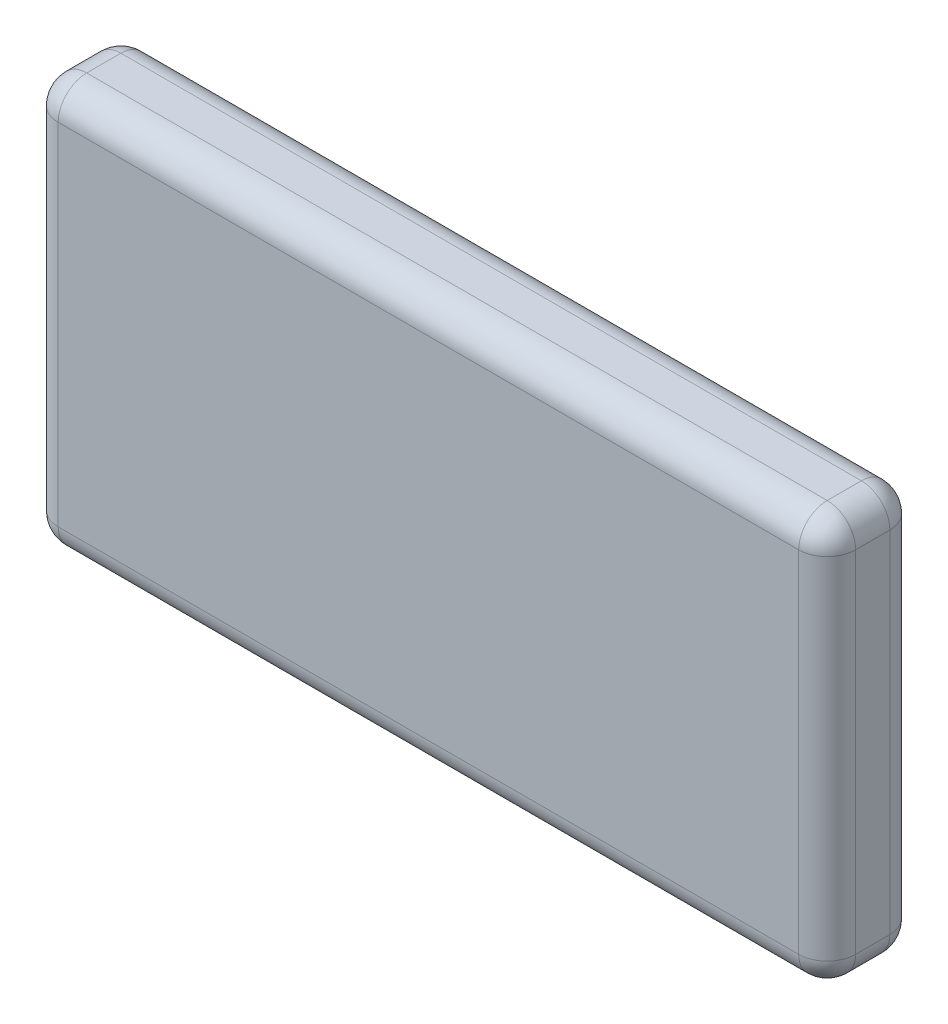
ISO-10303-21;
HEADER;
FILE_DESCRIPTION(('STEP AP214'),'2;1');
FILE_NAME('part.step','',(''),(''),'','','');
FILE_SCHEMA(('AUTOMOTIVE_DESIGN { 1 0 10303 214 1 1 1 1 }'));
ENDSEC;
DATA;
#1=APPLICATION_CONTEXT('core data for automotive mechanical design processes');
#2=APPLICATION_PROTOCOL_DEFINITION('international standard','automotive_design',2000,#1);
#3=PRODUCT_CONTEXT('',#1,'mechanical');
#4=PRODUCT('Part','Part','',(#3));
#5=PRODUCT_RELATED_PRODUCT_CATEGORY('part','',(#4));
#6=PRODUCT_DEFINITION_FORMATION('','',#4);
#7=PRODUCT_DEFINITION_CONTEXT('part definition',#1,'design');
#8=PRODUCT_DEFINITION('design','',#6,#7);
#9=PRODUCT_DEFINITION_SHAPE('','',#8);
#10=(LENGTH_UNIT() NAMED_UNIT(*) SI_UNIT(.MILLI.,.METRE.));
#11=(NAMED_UNIT(*) PLANE_ANGLE_UNIT() SI_UNIT($,.RADIAN.));
#12=(NAMED_UNIT(*) SI_UNIT($,.STERADIAN.) SOLID_ANGLE_UNIT());
#13=UNCERTAINTY_MEASURE_WITH_UNIT(LENGTH_MEASURE(1.E-05),#10,'distance_accuracy_value','');
#14=(GEOMETRIC_REPRESENTATION_CONTEXT(3) GLOBAL_UNCERTAINTY_ASSIGNED_CONTEXT((#13)) GLOBAL_UNIT_ASSIGNED_CONTEXT((#10,
#11,#12)) REPRESENTATION_CONTEXT('',''));
#15=CARTESIAN_POINT('',(0.,0.,0.));
#16=DIRECTION('',(0.,0.,1.));
#17=DIRECTION('',(1.,0.,0.));
#18=AXIS2_PLACEMENT_3D('',#15,#16,#17);
#19=CARTESIAN_POINT('',(70.,35.75,16.));
#20=DIRECTION('',(-1.,0.,0.));
#21=DIRECTION('',(0.,-1.,0.));
#22=AXIS2_PLACEMENT_3D('',#19,#20,#21);
#23=PLANE('',#22);
#24=DIRECTION('',(0.,0.,-1.));
#25=VECTOR('',#24,1.);
#26=CARTESIAN_POINT('',(70.,-30.75,16.));
#27=LINE('',#26,#25);
#28=CARTESIAN_POINT('',(70.,-30.75,11.));
#29=VERTEX_POINT('',#28);
#30=CARTESIAN_POINT('',(70.,-30.75,5.));
#31=VERTEX_POINT('',#30);
#32=EDGE_CURVE('E214',#29,#31,#27,.T.);
#33=ORIENTED_EDGE('',*,*,#32,.T.);
#34=DIRECTION('',(0.,1.,0.));
#35=VECTOR('',#34,1.);
#36=CARTESIAN_POINT('',(70.,35.75,5.));
#37=LINE('',#36,#35);
#38=CARTESIAN_POINT('',(70.,30.75,5.));
#39=VERTEX_POINT('',#38);
#40=EDGE_CURVE('E218',#31,#39,#37,.T.);
#41=ORIENTED_EDGE('',*,*,#40,.T.);
#42=DIRECTION('',(0.,0.,-1.));
#43=VECTOR('',#42,1.);
#44=CARTESIAN_POINT('',(70.,30.75,16.));
#45=LINE('',#44,#43);
#46=CARTESIAN_POINT('',(70.,30.75,11.));
#47=VERTEX_POINT('',#46);
#48=EDGE_CURVE('E211',#39,#47,#45,.F.);
#49=ORIENTED_EDGE('',*,*,#48,.T.);
#50=DIRECTION('',(0.,1.,0.));
#51=VECTOR('',#50,1.);
#52=CARTESIAN_POINT('',(70.,-35.75,11.));
#53=LINE('',#52,#51);
#54=EDGE_CURVE('E208',#47,#29,#53,.F.);
#55=ORIENTED_EDGE('',*,*,#54,.T.);
#56=EDGE_LOOP('',(#33,#41,#49,#55));
#57=FACE_BOUND('',#56,.T.);
#58=ADVANCED_FACE('F45',(#57),#23,.F.);
#59=CARTESIAN_POINT('',(-70.,35.75,16.));
#60=DIRECTION('',(0.,-1.,0.));
#61=DIRECTION('',(0.,0.,-1.));
#62=AXIS2_PLACEMENT_3D('',#59,#60,#61);
#63=PLANE('',#62);
#64=DIRECTION('',(0.,0.,-1.));
#65=VECTOR('',#64,1.);
#66=CARTESIAN_POINT('',(65.,35.75,16.));
#67=LINE('',#66,#65);
#68=CARTESIAN_POINT('',(65.,35.75,11.));
#69=VERTEX_POINT('',#68);
#70=CARTESIAN_POINT('',(65.,35.75,5.));
#71=VERTEX_POINT('',#70);
#72=EDGE_CURVE('E187',#69,#71,#67,.T.);
#73=ORIENTED_EDGE('',*,*,#72,.T.);
#74=DIRECTION('',(-1.,0.,0.));
#75=VECTOR('',#74,1.);
#76=CARTESIAN_POINT('',(-70.,35.75,5.));
#77=LINE('',#76,#75);
#78=CARTESIAN_POINT('',(-65.,35.75,5.));
#79=VERTEX_POINT('',#78);
#80=EDGE_CURVE('E194',#71,#79,#77,.T.);
#81=ORIENTED_EDGE('',*,*,#80,.T.);
#82=DIRECTION('',(0.,0.,-1.));
#83=VECTOR('',#82,1.);
#84=CARTESIAN_POINT('',(-65.,35.75,16.));
#85=LINE('',#84,#83);
#86=CARTESIAN_POINT('',(-65.,35.75,11.));
#87=VERTEX_POINT('',#86);
#88=EDGE_CURVE('E190',#79,#87,#85,.F.);
#89=ORIENTED_EDGE('',*,*,#88,.T.);
#90=DIRECTION('',(-1.,0.,0.));
#91=VECTOR('',#90,1.);
#92=CARTESIAN_POINT('',(70.,35.75,11.));
#93=LINE('',#92,#91);
#94=EDGE_CURVE('E184',#87,#69,#93,.F.);
#95=ORIENTED_EDGE('',*,*,#94,.T.);
#96=EDGE_LOOP('',(#73,#81,#89,#95));
#97=FACE_BOUND('',#96,.T.);
#98=ADVANCED_FACE('F365',(#97),#63,.F.);
#99=CARTESIAN_POINT('',(-70.,35.75,16.));
#100=DIRECTION('',(1.,0.,0.));
#101=DIRECTION('',(0.,1.,0.));
#102=AXIS2_PLACEMENT_3D('',#99,#100,#101);
#103=PLANE('',#102);
#104=DIRECTION('',(0.,0.,-1.));
#105=VECTOR('',#104,1.);
#106=CARTESIAN_POINT('',(-70.,30.75,16.));
#107=LINE('',#106,#105);
#108=CARTESIAN_POINT('',(-70.,30.75,11.));
#109=VERTEX_POINT('',#108);
#110=CARTESIAN_POINT('',(-70.,30.75,5.));
#111=VERTEX_POINT('',#110);
#112=EDGE_CURVE('E146',#109,#111,#107,.T.);
#113=ORIENTED_EDGE('',*,*,#112,.T.);
#114=DIRECTION('',(0.,-1.,0.));
#115=VECTOR('',#114,1.);
#116=CARTESIAN_POINT('',(-70.,35.75,5.));
#117=LINE('',#116,#115);
#118=CARTESIAN_POINT('',(-70.,-30.75,5.));
#119=VERTEX_POINT('',#118);
#120=EDGE_CURVE('E141',#111,#119,#117,.T.);
#121=ORIENTED_EDGE('',*,*,#120,.T.);
#122=DIRECTION('',(0.,0.,-1.));
#123=VECTOR('',#122,1.);
#124=CARTESIAN_POINT('',(-70.,-30.75,16.));
#125=LINE('',#124,#123);
#126=CARTESIAN_POINT('',(-70.,-30.75,11.));
#127=VERTEX_POINT('',#126);
#128=EDGE_CURVE('E133',#119,#127,#125,.F.);
#129=ORIENTED_EDGE('',*,*,#128,.T.);
#130=DIRECTION('',(0.,-1.,0.));
#131=VECTOR('',#130,1.);
#132=CARTESIAN_POINT('',(-70.,35.75,11.));
#133=LINE('',#132,#131);
#134=EDGE_CURVE('E138',#127,#109,#133,.F.);
#135=ORIENTED_EDGE('',*,*,#134,.T.);
#136=EDGE_LOOP('',(#113,#121,#129,#135));
#137=FACE_BOUND('',#136,.T.);
#138=ADVANCED_FACE('F136',(#137),#103,.F.);
#139=CARTESIAN_POINT('',(-70.,-35.75,16.));
#140=DIRECTION('',(0.,1.,0.));
#141=DIRECTION('',(0.,0.,1.));
#142=AXIS2_PLACEMENT_3D('',#139,#140,#141);
#143=PLANE('',#142);
#144=DIRECTION('',(0.,0.,-1.));
#145=VECTOR('',#144,1.);
#146=CARTESIAN_POINT('',(-65.,-35.75,16.));
#147=LINE('',#146,#145);
#148=CARTESIAN_POINT('',(-65.,-35.75,11.));
#149=VERTEX_POINT('',#148);
#150=CARTESIAN_POINT('',(-65.,-35.75,5.));
#151=VERTEX_POINT('',#150);
#152=EDGE_CURVE('E154',#149,#151,#147,.T.);
#153=ORIENTED_EDGE('',*,*,#152,.T.);
#154=DIRECTION('',(1.,0.,0.));
#155=VECTOR('',#154,1.);
#156=CARTESIAN_POINT('',(-70.,-35.75,5.));
#157=LINE('',#156,#155);
#158=CARTESIAN_POINT('',(65.,-35.75,5.));
#159=VERTEX_POINT('',#158);
#160=EDGE_CURVE('E205',#151,#159,#157,.T.);
#161=ORIENTED_EDGE('',*,*,#160,.T.);
#162=DIRECTION('',(0.,0.,-1.));
#163=VECTOR('',#162,1.);
#164=CARTESIAN_POINT('',(65.,-35.75,16.));
#165=LINE('',#164,#163);
#166=CARTESIAN_POINT('',(65.,-35.75,11.));
#167=VERTEX_POINT('',#166);
#168=EDGE_CURVE('E200',#159,#167,#165,.F.);
#169=ORIENTED_EDGE('',*,*,#168,.T.);
#170=DIRECTION('',(1.,0.,0.));
#171=VECTOR('',#170,1.);
#172=CARTESIAN_POINT('',(-70.,-35.75,11.));
#173=LINE('',#172,#171);
#174=EDGE_CURVE('E197',#167,#149,#173,.F.);
#175=ORIENTED_EDGE('',*,*,#174,.T.);
#176=EDGE_LOOP('',(#153,#161,#169,#175));
#177=FACE_BOUND('',#176,.T.);
#178=ADVANCED_FACE('F356',(#177),#143,.F.);
#179=CARTESIAN_POINT('',(0.,0.,16.));
#180=DIRECTION('',(0.,0.,1.));
#181=DIRECTION('',(1.,0.,0.));
#182=AXIS2_PLACEMENT_3D('',#179,#180,#181);
#183=PLANE('',#182);
#184=DIRECTION('',(0.,-1.,0.));
#185=VECTOR('',#184,1.);
#186=CARTESIAN_POINT('',(-65.,-35.75,16.));
#187=LINE('',#186,#185);
#188=CARTESIAN_POINT('',(-65.,30.75,16.));
#189=VERTEX_POINT('',#188);
#190=CARTESIAN_POINT('',(-65.,-30.75,16.));
#191=VERTEX_POINT('',#190);
#192=EDGE_CURVE('E55',#189,#191,#187,.T.);
#193=ORIENTED_EDGE('',*,*,#192,.T.);
#194=DIRECTION('',(1.,0.,0.));
#195=VECTOR('',#194,1.);
#196=CARTESIAN_POINT('',(70.,-30.75,16.));
#197=LINE('',#196,#195);
#198=CARTESIAN_POINT('',(65.,-30.75,16.));
#199=VERTEX_POINT('',#198);
#200=EDGE_CURVE('E11',#191,#199,#197,.T.);
#201=ORIENTED_EDGE('',*,*,#200,.T.);
#202=DIRECTION('',(0.,1.,0.));
#203=VECTOR('',#202,1.);
#204=CARTESIAN_POINT('',(65.,35.75,16.));
#205=LINE('',#204,#203);
#206=CARTESIAN_POINT('',(65.,30.75,16.));
#207=VERTEX_POINT('',#206);
#208=EDGE_CURVE('E234',#199,#207,#205,.T.);
#209=ORIENTED_EDGE('',*,*,#208,.T.);
#210=DIRECTION('',(-1.,0.,0.));
#211=VECTOR('',#210,1.);
#212=CARTESIAN_POINT('',(-70.,30.75,16.));
#213=LINE('',#212,#211);
#214=EDGE_CURVE('E66',#207,#189,#213,.T.);
#215=ORIENTED_EDGE('',*,*,#214,.T.);
#216=EDGE_LOOP('',(#193,#201,#209,#215));
#217=FACE_BOUND('',#216,.T.);
#218=ADVANCED_FACE('F358',(#217),#183,.T.);
#219=CARTESIAN_POINT('',(0.,0.,0.));
#220=DIRECTION('',(0.,0.,1.));
#221=DIRECTION('',(1.,0.,0.));
#222=AXIS2_PLACEMENT_3D('',#219,#220,#221);
#223=PLANE('',#222);
#224=DIRECTION('',(0.,-1.,0.));
#225=VECTOR('',#224,1.);
#226=CARTESIAN_POINT('',(-65.,0.,0.));
#227=LINE('',#226,#225);
#228=CARTESIAN_POINT('',(-65.,-30.75,0.));
#229=VERTEX_POINT('',#228);
#230=CARTESIAN_POINT('',(-65.,30.75,0.));
#231=VERTEX_POINT('',#230);
#232=EDGE_CURVE('E227',#229,#231,#227,.F.);
#233=ORIENTED_EDGE('',*,*,#232,.T.);
#234=DIRECTION('',(-1.,0.,0.));
#235=VECTOR('',#234,1.);
#236=CARTESIAN_POINT('',(0.,30.75,0.));
#237=LINE('',#236,#235);
#238=CARTESIAN_POINT('',(65.,30.75,0.));
#239=VERTEX_POINT('',#238);
#240=EDGE_CURVE('E230',#231,#239,#237,.F.);
#241=ORIENTED_EDGE('',*,*,#240,.T.);
#242=DIRECTION('',(0.,1.,0.));
#243=VECTOR('',#242,1.);
#244=CARTESIAN_POINT('',(65.,0.,0.));
#245=LINE('',#244,#243);
#246=CARTESIAN_POINT('',(65.,-30.75,0.));
#247=VERTEX_POINT('',#246);
#248=EDGE_CURVE('E221',#239,#247,#245,.F.);
#249=ORIENTED_EDGE('',*,*,#248,.T.);
#250=DIRECTION('',(1.,0.,0.));
#251=VECTOR('',#250,1.);
#252=CARTESIAN_POINT('',(0.,-30.75,0.));
#253=LINE('',#252,#251);
#254=EDGE_CURVE('E224',#247,#229,#253,.F.);
#255=ORIENTED_EDGE('',*,*,#254,.T.);
#256=EDGE_LOOP('',(#233,#241,#249,#255));
#257=FACE_BOUND('',#256,.T.);
#258=ADVANCED_FACE('F325',(#257),#223,.F.);
#259=CARTESIAN_POINT('',(65.,-30.75,16.));
#260=DIRECTION('',(0.,0.,-1.));
#261=DIRECTION('',(-1.,0.,0.));
#262=AXIS2_PLACEMENT_3D('',#259,#260,#261);
#263=CYLINDRICAL_SURFACE('',#262,5.);
#264=CARTESIAN_POINT('',(65.,-30.75,11.));
#265=DIRECTION('',(0.,0.,1.));
#266=DIRECTION('',(1.,0.,0.));
#267=AXIS2_PLACEMENT_3D('',#264,#265,#266);
#268=CIRCLE('',#267,5.);
#269=EDGE_CURVE('E49',#167,#29,#268,.T.);
#270=ORIENTED_EDGE('',*,*,#269,.F.);
#271=ORIENTED_EDGE('',*,*,#168,.F.);
#272=CARTESIAN_POINT('',(65.,-30.75,5.));
#273=DIRECTION('',(0.,0.,-1.));
#274=DIRECTION('',(-1.,0.,0.));
#275=AXIS2_PLACEMENT_3D('',#272,#273,#274);
#276=CIRCLE('',#275,5.);
#277=EDGE_CURVE('E178',#31,#159,#276,.T.);
#278=ORIENTED_EDGE('',*,*,#277,.F.);
#279=ORIENTED_EDGE('',*,*,#32,.F.);
#280=EDGE_LOOP('',(#270,#271,#278,#279));
#281=FACE_BOUND('',#280,.T.);
#282=ADVANCED_FACE('F47',(#281),#263,.T.);
#283=CARTESIAN_POINT('',(65.,-30.75,11.));
#284=DIRECTION('',(1.,0.,0.));
#285=DIRECTION('',(0.,1.,0.));
#286=AXIS2_PLACEMENT_3D('',#283,#284,#285);
#287=SPHERICAL_SURFACE('',#286,5.);
#288=CARTESIAN_POINT('',(65.,-30.75,11.));
#289=DIRECTION('',(1.,0.,0.));
#290=DIRECTION('',(0.,1.,0.));
#291=AXIS2_PLACEMENT_3D('',#288,#289,#290);
#292=CIRCLE('',#291,5.);
#293=EDGE_CURVE('E301',#167,#199,#292,.F.);
#294=ORIENTED_EDGE('',*,*,#293,.F.);
#295=ORIENTED_EDGE('',*,*,#269,.T.);
#296=CARTESIAN_POINT('',(65.,-30.75,11.));
#297=DIRECTION('',(0.,-1.,0.));
#298=DIRECTION('',(0.,0.,-1.));
#299=AXIS2_PLACEMENT_3D('',#296,#297,#298);
#300=CIRCLE('',#299,5.);
#301=EDGE_CURVE('E305',#199,#29,#300,.F.);
#302=ORIENTED_EDGE('',*,*,#301,.F.);
#303=EDGE_LOOP('',(#294,#295,#302));
#304=FACE_BOUND('',#303,.T.);
#305=ADVANCED_FACE('F351',(#304),#287,.T.);
#306=CARTESIAN_POINT('',(65.,-30.75,5.));
#307=DIRECTION('',(0.,-1.,0.));
#308=DIRECTION('',(0.,0.,-1.));
#309=AXIS2_PLACEMENT_3D('',#306,#307,#308);
#310=SPHERICAL_SURFACE('',#309,5.);
#311=CARTESIAN_POINT('',(65.,-30.75,5.));
#312=DIRECTION('',(0.,-1.,0.));
#313=DIRECTION('',(1.,0.,0.));
#314=AXIS2_PLACEMENT_3D('',#311,#312,#313);
#315=CIRCLE('',#314,5.);
#316=EDGE_CURVE('E293',#31,#247,#315,.F.);
#317=ORIENTED_EDGE('',*,*,#316,.F.);
#318=ORIENTED_EDGE('',*,*,#277,.T.);
#319=CARTESIAN_POINT('',(65.,-30.75,5.));
#320=DIRECTION('',(1.,0.,0.));
#321=DIRECTION('',(0.,0.,-1.));
#322=AXIS2_PLACEMENT_3D('',#319,#320,#321);
#323=CIRCLE('',#322,5.);
#324=EDGE_CURVE('E297',#247,#159,#323,.F.);
#325=ORIENTED_EDGE('',*,*,#324,.F.);
#326=EDGE_LOOP('',(#317,#318,#325));
#327=FACE_BOUND('',#326,.T.);
#328=ADVANCED_FACE('F314',(#327),#310,.T.);
#329=CARTESIAN_POINT('',(65.,0.,11.));
#330=DIRECTION('',(0.,-1.,0.));
#331=DIRECTION('',(1.,0.,0.));
#332=AXIS2_PLACEMENT_3D('',#329,#330,#331);
#333=CYLINDRICAL_SURFACE('',#332,5.);
#334=ORIENTED_EDGE('',*,*,#301,.T.);
#335=ORIENTED_EDGE('',*,*,#54,.F.);
#336=CARTESIAN_POINT('',(65.,30.75,11.));
#337=DIRECTION('',(0.,1.,0.));
#338=DIRECTION('',(0.,0.,1.));
#339=AXIS2_PLACEMENT_3D('',#336,#337,#338);
#340=CIRCLE('',#339,5.);
#341=EDGE_CURVE('E285',#207,#47,#340,.T.);
#342=ORIENTED_EDGE('',*,*,#341,.F.);
#343=ORIENTED_EDGE('',*,*,#208,.F.);
#344=EDGE_LOOP('',(#334,#335,#342,#343));
#345=FACE_BOUND('',#344,.T.);
#346=ADVANCED_FACE('F346',(#345),#333,.T.);
#347=CARTESIAN_POINT('',(0.,-30.75,11.));
#348=DIRECTION('',(-1.,0.,0.));
#349=DIRECTION('',(0.,0.,1.));
#350=AXIS2_PLACEMENT_3D('',#347,#348,#349);
#351=CYLINDRICAL_SURFACE('',#350,5.);
#352=ORIENTED_EDGE('',*,*,#293,.T.);
#353=ORIENTED_EDGE('',*,*,#200,.F.);
#354=CARTESIAN_POINT('',(-65.,-30.75,11.));
#355=DIRECTION('',(-1.,0.,0.));
#356=DIRECTION('',(0.,0.,1.));
#357=AXIS2_PLACEMENT_3D('',#354,#355,#356);
#358=CIRCLE('',#357,5.);
#359=EDGE_CURVE('E159',#149,#191,#358,.T.);
#360=ORIENTED_EDGE('',*,*,#359,.F.);
#361=ORIENTED_EDGE('',*,*,#174,.F.);
#362=EDGE_LOOP('',(#352,#353,#360,#361));
#363=FACE_BOUND('',#362,.T.);
#364=ADVANCED_FACE('F354',(#363),#351,.T.);
#365=CARTESIAN_POINT('',(-65.,-30.75,16.));
#366=DIRECTION('',(0.,0.,-1.));
#367=DIRECTION('',(-1.,0.,0.));
#368=AXIS2_PLACEMENT_3D('',#365,#366,#367);
#369=CYLINDRICAL_SURFACE('',#368,5.);
#370=CARTESIAN_POINT('',(-65.,-30.75,5.));
#371=DIRECTION('',(0.,0.,-1.));
#372=DIRECTION('',(-1.,0.,0.));
#373=AXIS2_PLACEMENT_3D('',#370,#371,#372);
#374=CIRCLE('',#373,5.);
#375=EDGE_CURVE('E160',#151,#119,#374,.T.);
#376=ORIENTED_EDGE('',*,*,#375,.F.);
#377=ORIENTED_EDGE('',*,*,#152,.F.);
#378=CARTESIAN_POINT('',(-65.,-30.75,11.));
#379=DIRECTION('',(0.,0.,1.));
#380=DIRECTION('',(1.,0.,0.));
#381=AXIS2_PLACEMENT_3D('',#378,#379,#380);
#382=CIRCLE('',#381,5.);
#383=EDGE_CURVE('E150',#127,#149,#382,.T.);
#384=ORIENTED_EDGE('',*,*,#383,.F.);
#385=ORIENTED_EDGE('',*,*,#128,.F.);
#386=EDGE_LOOP('',(#376,#377,#384,#385));
#387=FACE_BOUND('',#386,.T.);
#388=ADVANCED_FACE('F152',(#387),#369,.T.);
#389=CARTESIAN_POINT('',(-70.,-30.75,5.));
#390=DIRECTION('',(1.,0.,0.));
#391=DIRECTION('',(0.,0.,-1.));
#392=AXIS2_PLACEMENT_3D('',#389,#390,#391);
#393=CYLINDRICAL_SURFACE('',#392,5.);
#394=ORIENTED_EDGE('',*,*,#324,.T.);
#395=ORIENTED_EDGE('',*,*,#160,.F.);
#396=CARTESIAN_POINT('',(-65.,-30.75,5.));
#397=DIRECTION('',(-1.,0.,0.));
#398=DIRECTION('',(0.,0.,1.));
#399=AXIS2_PLACEMENT_3D('',#396,#397,#398);
#400=CIRCLE('',#399,5.);
#401=EDGE_CURVE('E278',#229,#151,#400,.T.);
#402=ORIENTED_EDGE('',*,*,#401,.F.);
#403=ORIENTED_EDGE('',*,*,#254,.F.);
#404=EDGE_LOOP('',(#394,#395,#402,#403));
#405=FACE_BOUND('',#404,.T.);
#406=ADVANCED_FACE('F321',(#405),#393,.T.);
#407=CARTESIAN_POINT('',(65.,35.75,5.));
#408=DIRECTION('',(0.,1.,0.));
#409=DIRECTION('',(-1.,0.,0.));
#410=AXIS2_PLACEMENT_3D('',#407,#408,#409);
#411=CYLINDRICAL_SURFACE('',#410,5.);
#412=ORIENTED_EDGE('',*,*,#316,.T.);
#413=ORIENTED_EDGE('',*,*,#248,.F.);
#414=CARTESIAN_POINT('',(65.,30.75,5.));
#415=DIRECTION('',(0.,1.,0.));
#416=DIRECTION('',(0.,0.,1.));
#417=AXIS2_PLACEMENT_3D('',#414,#415,#416);
#418=CIRCLE('',#417,5.);
#419=EDGE_CURVE('E274',#39,#239,#418,.T.);
#420=ORIENTED_EDGE('',*,*,#419,.F.);
#421=ORIENTED_EDGE('',*,*,#40,.F.);
#422=EDGE_LOOP('',(#412,#413,#420,#421));
#423=FACE_BOUND('',#422,.T.);
#424=ADVANCED_FACE('F331',(#423),#411,.T.);
#425=CARTESIAN_POINT('',(65.,30.75,16.));
#426=DIRECTION('',(0.,0.,-1.));
#427=DIRECTION('',(-1.,0.,0.));
#428=AXIS2_PLACEMENT_3D('',#425,#426,#427);
#429=CYLINDRICAL_SURFACE('',#428,5.);
#430=CARTESIAN_POINT('',(65.,30.75,11.));
#431=DIRECTION('',(0.,0.,1.));
#432=DIRECTION('',(1.,0.,0.));
#433=AXIS2_PLACEMENT_3D('',#430,#431,#432);
#434=CIRCLE('',#433,5.);
#435=EDGE_CURVE('E289',#47,#69,#434,.T.);
#436=ORIENTED_EDGE('',*,*,#435,.F.);
#437=ORIENTED_EDGE('',*,*,#48,.F.);
#438=CARTESIAN_POINT('',(65.,30.75,5.));
#439=DIRECTION('',(0.,0.,-1.));
#440=DIRECTION('',(-1.,0.,0.));
#441=AXIS2_PLACEMENT_3D('',#438,#439,#440);
#442=CIRCLE('',#441,5.);
#443=EDGE_CURVE('E270',#71,#39,#442,.T.);
#444=ORIENTED_EDGE('',*,*,#443,.F.);
#445=ORIENTED_EDGE('',*,*,#72,.F.);
#446=EDGE_LOOP('',(#436,#437,#444,#445));
#447=FACE_BOUND('',#446,.T.);
#448=ADVANCED_FACE('F338',(#447),#429,.T.);
#449=CARTESIAN_POINT('',(65.,30.75,11.));
#450=DIRECTION('',(1.,0.,0.));
#451=DIRECTION('',(0.,0.,-1.));
#452=AXIS2_PLACEMENT_3D('',#449,#450,#451);
#453=SPHERICAL_SURFACE('',#452,5.);
#454=ORIENTED_EDGE('',*,*,#341,.T.);
#455=ORIENTED_EDGE('',*,*,#435,.T.);
#456=CARTESIAN_POINT('',(65.,30.75,11.));
#457=DIRECTION('',(1.,0.,0.));
#458=DIRECTION('',(0.,0.,-1.));
#459=AXIS2_PLACEMENT_3D('',#456,#457,#458);
#460=CIRCLE('',#459,5.);
#461=EDGE_CURVE('E167',#207,#69,#460,.F.);
#462=ORIENTED_EDGE('',*,*,#461,.F.);
#463=EDGE_LOOP('',(#454,#455,#462));
#464=FACE_BOUND('',#463,.T.);
#465=ADVANCED_FACE('F344',(#464),#453,.T.);
#466=CARTESIAN_POINT('',(-65.,-30.75,11.));
#467=DIRECTION('',(0.,-1.,0.));
#468=DIRECTION('',(0.,0.,-1.));
#469=AXIS2_PLACEMENT_3D('',#466,#467,#468);
#470=SPHERICAL_SURFACE('',#469,5.);
#471=ORIENTED_EDGE('',*,*,#383,.T.);
#472=ORIENTED_EDGE('',*,*,#359,.T.);
#473=CARTESIAN_POINT('',(-65.,-30.75,11.));
#474=DIRECTION('',(0.,-1.,0.));
#475=DIRECTION('',(0.,0.,-1.));
#476=AXIS2_PLACEMENT_3D('',#473,#474,#475);
#477=CIRCLE('',#476,5.);
#478=EDGE_CURVE('E163',#127,#191,#477,.F.);
#479=ORIENTED_EDGE('',*,*,#478,.F.);
#480=EDGE_LOOP('',(#471,#472,#479));
#481=FACE_BOUND('',#480,.T.);
#482=ADVANCED_FACE('F164',(#481),#470,.T.);
#483=CARTESIAN_POINT('',(-65.,-30.75,5.));
#484=DIRECTION('',(0.,-1.,0.));
#485=DIRECTION('',(0.,0.,-1.));
#486=AXIS2_PLACEMENT_3D('',#483,#484,#485);
#487=SPHERICAL_SURFACE('',#486,5.);
#488=ORIENTED_EDGE('',*,*,#401,.T.);
#489=ORIENTED_EDGE('',*,*,#375,.T.);
#490=CARTESIAN_POINT('',(-65.,-30.75,5.));
#491=DIRECTION('',(0.,-1.,0.));
#492=DIRECTION('',(0.,0.,-1.));
#493=AXIS2_PLACEMENT_3D('',#490,#491,#492);
#494=CIRCLE('',#493,5.);
#495=EDGE_CURVE('E168',#229,#119,#494,.F.);
#496=ORIENTED_EDGE('',*,*,#495,.F.);
#497=EDGE_LOOP('',(#488,#489,#496));
#498=FACE_BOUND('',#497,.T.);
#499=ADVANCED_FACE('F405',(#498),#487,.T.);
#500=CARTESIAN_POINT('',(65.,30.75,5.));
#501=DIRECTION('',(1.,0.,0.));
#502=DIRECTION('',(0.,0.,-1.));
#503=AXIS2_PLACEMENT_3D('',#500,#501,#502);
#504=SPHERICAL_SURFACE('',#503,5.);
#505=ORIENTED_EDGE('',*,*,#443,.T.);
#506=ORIENTED_EDGE('',*,*,#419,.T.);
#507=CARTESIAN_POINT('',(65.,30.75,5.));
#508=DIRECTION('',(1.,0.,0.));
#509=DIRECTION('',(0.,0.,-1.));
#510=AXIS2_PLACEMENT_3D('',#507,#508,#509);
#511=CIRCLE('',#510,5.);
#512=EDGE_CURVE('E261',#71,#239,#511,.F.);
#513=ORIENTED_EDGE('',*,*,#512,.F.);
#514=EDGE_LOOP('',(#505,#506,#513));
#515=FACE_BOUND('',#514,.T.);
#516=ADVANCED_FACE('F401',(#515),#504,.T.);
#517=CARTESIAN_POINT('',(0.,30.75,11.));
#518=DIRECTION('',(1.,0.,0.));
#519=DIRECTION('',(0.,0.,-1.));
#520=AXIS2_PLACEMENT_3D('',#517,#518,#519);
#521=CYLINDRICAL_SURFACE('',#520,5.);
#522=ORIENTED_EDGE('',*,*,#461,.T.);
#523=ORIENTED_EDGE('',*,*,#94,.F.);
#524=CARTESIAN_POINT('',(-65.,30.75,11.));
#525=DIRECTION('',(-1.,0.,0.));
#526=DIRECTION('',(0.,0.,1.));
#527=AXIS2_PLACEMENT_3D('',#524,#525,#526);
#528=CIRCLE('',#527,5.);
#529=EDGE_CURVE('E257',#189,#87,#528,.T.);
#530=ORIENTED_EDGE('',*,*,#529,.F.);
#531=ORIENTED_EDGE('',*,*,#214,.F.);
#532=EDGE_LOOP('',(#522,#523,#530,#531));
#533=FACE_BOUND('',#532,.T.);
#534=ADVANCED_FACE('F398',(#533),#521,.T.);
#535=CARTESIAN_POINT('',(-65.,0.,11.));
#536=DIRECTION('',(0.,1.,0.));
#537=DIRECTION('',(-1.,0.,0.));
#538=AXIS2_PLACEMENT_3D('',#535,#536,#537);
#539=CYLINDRICAL_SURFACE('',#538,5.);
#540=ORIENTED_EDGE('',*,*,#478,.T.);
#541=ORIENTED_EDGE('',*,*,#192,.F.);
#542=CARTESIAN_POINT('',(-65.,30.75,11.));
#543=DIRECTION('',(0.,1.,0.));
#544=DIRECTION('',(0.,0.,1.));
#545=AXIS2_PLACEMENT_3D('',#542,#543,#544);
#546=CIRCLE('',#545,5.);
#547=EDGE_CURVE('E172',#109,#189,#546,.T.);
#548=ORIENTED_EDGE('',*,*,#547,.F.);
#549=ORIENTED_EDGE('',*,*,#134,.F.);
#550=EDGE_LOOP('',(#540,#541,#548,#549));
#551=FACE_BOUND('',#550,.T.);
#552=ADVANCED_FACE('F170',(#551),#539,.T.);
#553=CARTESIAN_POINT('',(-65.,35.75,5.));
#554=DIRECTION('',(0.,-1.,0.));
#555=DIRECTION('',(1.,0.,0.));
#556=AXIS2_PLACEMENT_3D('',#553,#554,#555);
#557=CYLINDRICAL_SURFACE('',#556,5.);
#558=ORIENTED_EDGE('',*,*,#495,.T.);
#559=ORIENTED_EDGE('',*,*,#120,.F.);
#560=CARTESIAN_POINT('',(-65.,30.75,5.));
#561=DIRECTION('',(0.,1.,0.));
#562=DIRECTION('',(0.,0.,1.));
#563=AXIS2_PLACEMENT_3D('',#560,#561,#562);
#564=CIRCLE('',#563,5.);
#565=EDGE_CURVE('E251',#231,#111,#564,.T.);
#566=ORIENTED_EDGE('',*,*,#565,.F.);
#567=ORIENTED_EDGE('',*,*,#232,.F.);
#568=EDGE_LOOP('',(#558,#559,#566,#567));
#569=FACE_BOUND('',#568,.T.);
#570=ADVANCED_FACE('F391',(#569),#557,.T.);
#571=CARTESIAN_POINT('',(-70.,30.75,5.));
#572=DIRECTION('',(-1.,0.,0.));
#573=DIRECTION('',(0.,0.,1.));
#574=AXIS2_PLACEMENT_3D('',#571,#572,#573);
#575=CYLINDRICAL_SURFACE('',#574,5.);
#576=ORIENTED_EDGE('',*,*,#512,.T.);
#577=ORIENTED_EDGE('',*,*,#240,.F.);
#578=CARTESIAN_POINT('',(-65.,30.75,5.));
#579=DIRECTION('',(-1.,0.,0.));
#580=DIRECTION('',(0.,0.,1.));
#581=AXIS2_PLACEMENT_3D('',#578,#579,#580);
#582=CIRCLE('',#581,5.);
#583=EDGE_CURVE('E247',#79,#231,#582,.T.);
#584=ORIENTED_EDGE('',*,*,#583,.F.);
#585=ORIENTED_EDGE('',*,*,#80,.F.);
#586=EDGE_LOOP('',(#576,#577,#584,#585));
#587=FACE_BOUND('',#586,.T.);
#588=ADVANCED_FACE('F387',(#587),#575,.T.);
#589=CARTESIAN_POINT('',(-65.,30.75,11.));
#590=DIRECTION('',(0.,0.,1.));
#591=DIRECTION('',(1.,0.,0.));
#592=AXIS2_PLACEMENT_3D('',#589,#590,#591);
#593=SPHERICAL_SURFACE('',#592,5.);
#594=ORIENTED_EDGE('',*,*,#547,.T.);
#595=ORIENTED_EDGE('',*,*,#529,.T.);
#596=CARTESIAN_POINT('',(-65.,30.75,11.));
#597=DIRECTION('',(0.,0.,1.));
#598=DIRECTION('',(1.,0.,0.));
#599=AXIS2_PLACEMENT_3D('',#596,#597,#598);
#600=CIRCLE('',#599,5.);
#601=EDGE_CURVE('E244',#109,#87,#600,.F.);
#602=ORIENTED_EDGE('',*,*,#601,.F.);
#603=EDGE_LOOP('',(#594,#595,#602));
#604=FACE_BOUND('',#603,.T.);
#605=ADVANCED_FACE('F383',(#604),#593,.T.);
#606=CARTESIAN_POINT('',(-65.,30.75,5.));
#607=DIRECTION('',(0.,0.,-1.));
#608=DIRECTION('',(-1.,0.,0.));
#609=AXIS2_PLACEMENT_3D('',#606,#607,#608);
#610=SPHERICAL_SURFACE('',#609,5.);
#611=ORIENTED_EDGE('',*,*,#583,.T.);
#612=ORIENTED_EDGE('',*,*,#565,.T.);
#613=CARTESIAN_POINT('',(-65.,30.75,5.));
#614=DIRECTION('',(0.,0.,-1.));
#615=DIRECTION('',(-1.,0.,0.));
#616=AXIS2_PLACEMENT_3D('',#613,#614,#615);
#617=CIRCLE('',#616,5.);
#618=EDGE_CURVE('E241',#79,#111,#617,.F.);
#619=ORIENTED_EDGE('',*,*,#618,.F.);
#620=EDGE_LOOP('',(#611,#612,#619));
#621=FACE_BOUND('',#620,.T.);
#622=ADVANCED_FACE('F379',(#621),#610,.T.);
#623=CARTESIAN_POINT('',(-65.,30.75,16.));
#624=DIRECTION('',(0.,0.,-1.));
#625=DIRECTION('',(-1.,0.,0.));
#626=AXIS2_PLACEMENT_3D('',#623,#624,#625);
#627=CYLINDRICAL_SURFACE('',#626,5.);
#628=ORIENTED_EDGE('',*,*,#601,.T.);
#629=ORIENTED_EDGE('',*,*,#88,.F.);
#630=ORIENTED_EDGE('',*,*,#618,.T.);
#631=ORIENTED_EDGE('',*,*,#112,.F.);
#632=EDGE_LOOP('',(#628,#629,#630,#631));
#633=FACE_BOUND('',#632,.T.);
#634=ADVANCED_FACE('F376',(#633),#627,.T.);
#635=CLOSED_SHELL('',(#58,#98,#138,#178,#218,#258,#282,#305,#328,#346,#364,#388,#406,#424,#448,
#465,#482,#499,#516,#534,#552,#570,#588,#605,#622,#634));
#636=MANIFOLD_SOLID_BREP('B2',#635);
#637=ADVANCED_BREP_SHAPE_REPRESENTATION('',(#18,#636),#14);
#638=SHAPE_DEFINITION_REPRESENTATION(#9,#637);
ENDSEC;
END-ISO-10303-21;
